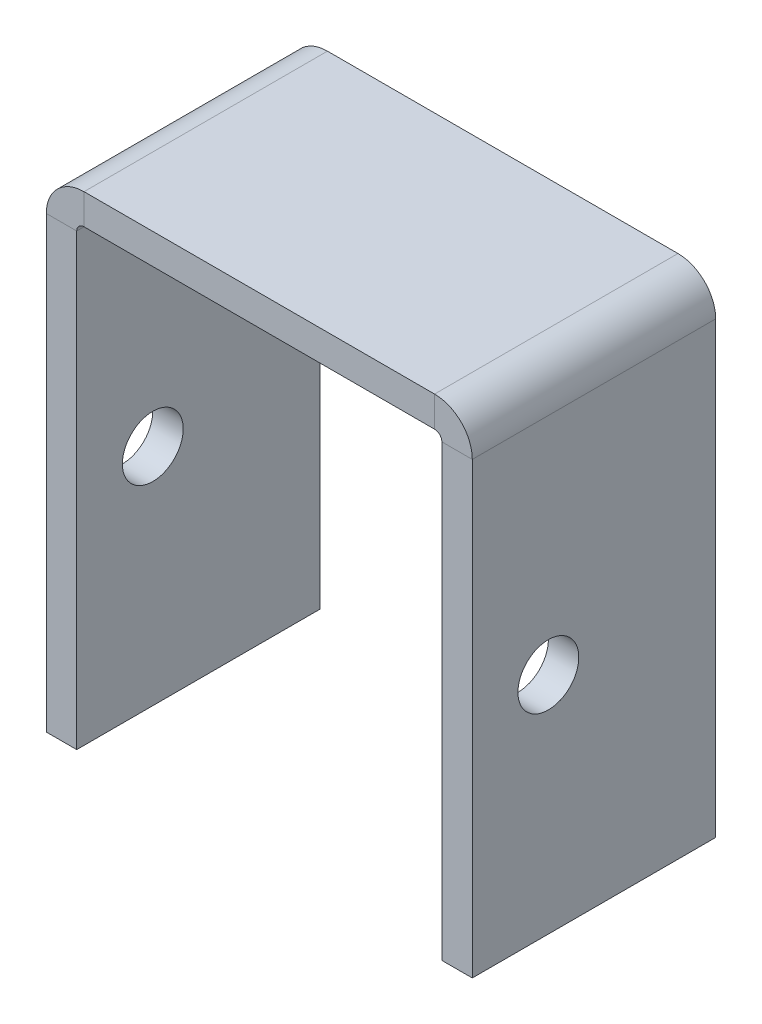
ISO-10303-21;
HEADER;
FILE_DESCRIPTION(('STEP AP214'),'2;1');
FILE_NAME('part.step','',(''),(''),'','','');
FILE_SCHEMA(('AUTOMOTIVE_DESIGN { 1 0 10303 214 1 1 1 1 }'));
ENDSEC;
DATA;
#1=APPLICATION_CONTEXT('core data for automotive mechanical design processes');
#2=APPLICATION_PROTOCOL_DEFINITION('international standard','automotive_design',2000,#1);
#3=PRODUCT_CONTEXT('',#1,'mechanical');
#4=PRODUCT('Part','Part','',(#3));
#5=PRODUCT_RELATED_PRODUCT_CATEGORY('part','',(#4));
#6=PRODUCT_DEFINITION_FORMATION('','',#4);
#7=PRODUCT_DEFINITION_CONTEXT('part definition',#1,'design');
#8=PRODUCT_DEFINITION('design','',#6,#7);
#9=PRODUCT_DEFINITION_SHAPE('','',#8);
#10=(LENGTH_UNIT() NAMED_UNIT(*) SI_UNIT(.MILLI.,.METRE.));
#11=(NAMED_UNIT(*) PLANE_ANGLE_UNIT() SI_UNIT($,.RADIAN.));
#12=(NAMED_UNIT(*) SI_UNIT($,.STERADIAN.) SOLID_ANGLE_UNIT());
#13=UNCERTAINTY_MEASURE_WITH_UNIT(LENGTH_MEASURE(1.E-05),#10,'distance_accuracy_value','');
#14=(GEOMETRIC_REPRESENTATION_CONTEXT(3) GLOBAL_UNCERTAINTY_ASSIGNED_CONTEXT((#13)) GLOBAL_UNIT_ASSIGNED_CONTEXT((#10,
#11,#12)) REPRESENTATION_CONTEXT('',''));
#15=CARTESIAN_POINT('',(0.,0.,0.));
#16=DIRECTION('',(0.,0.,1.));
#17=DIRECTION('',(1.,0.,0.));
#18=AXIS2_PLACEMENT_3D('',#15,#16,#17);
#19=CARTESIAN_POINT('',(22.225,-3.93699999999999,25.4));
#20=DIRECTION('',(0.,0.,1.));
#21=DIRECTION('',(1.,0.,0.));
#22=AXIS2_PLACEMENT_3D('',#19,#20,#21);
#23=PLANE('',#22);
#24=DIRECTION('',(-1.,0.,0.));
#25=VECTOR('',#24,1.);
#26=CARTESIAN_POINT('',(22.225,-3.93699999999999,25.4));
#27=LINE('',#26,#25);
#28=CARTESIAN_POINT('',(22.225,-3.93699999999999,25.4));
#29=VERTEX_POINT('',#28);
#30=CARTESIAN_POINT('',(19.05,-3.93699999999999,25.4));
#31=VERTEX_POINT('',#30);
#32=EDGE_CURVE('E11',#29,#31,#27,.T.);
#33=ORIENTED_EDGE('',*,*,#32,.F.);
#34=CARTESIAN_POINT('',(18.288,-3.93699999999999,25.4));
#35=DIRECTION('',(0.,0.,-1.));
#36=DIRECTION('',(-1.,0.,0.));
#37=AXIS2_PLACEMENT_3D('',#34,#35,#36);
#38=CIRCLE('',#37,3.937);
#39=CARTESIAN_POINT('',(18.288,0.,25.4));
#40=VERTEX_POINT('',#39);
#41=EDGE_CURVE('E253',#40,#29,#38,.T.);
#42=ORIENTED_EDGE('',*,*,#41,.F.);
#43=DIRECTION('',(0.,1.,0.));
#44=VECTOR('',#43,1.);
#45=CARTESIAN_POINT('',(18.288,-3.17499999999999,25.4));
#46=LINE('',#45,#44);
#47=CARTESIAN_POINT('',(18.288,-3.17499999999999,25.4));
#48=VERTEX_POINT('',#47);
#49=EDGE_CURVE('E54',#48,#40,#46,.T.);
#50=ORIENTED_EDGE('',*,*,#49,.F.);
#51=CARTESIAN_POINT('',(18.288,-3.93699999999999,25.4));
#52=DIRECTION('',(0.,0.,1.));
#53=DIRECTION('',(1.,0.,0.));
#54=AXIS2_PLACEMENT_3D('',#51,#52,#53);
#55=CIRCLE('',#54,0.762);
#56=EDGE_CURVE('E178',#48,#31,#55,.F.);
#57=ORIENTED_EDGE('',*,*,#56,.T.);
#58=EDGE_LOOP('',(#33,#42,#50,#57));
#59=FACE_BOUND('',#58,.T.);
#60=ADVANCED_FACE('F45',(#59),#23,.T.);
#61=CARTESIAN_POINT('',(18.288,-3.17499999999999,25.4));
#62=DIRECTION('',(0.,0.,1.));
#63=DIRECTION('',(1.,0.,0.));
#64=AXIS2_PLACEMENT_3D('',#61,#62,#63);
#65=PLANE('',#64);
#66=DIRECTION('',(0.,-1.,0.));
#67=VECTOR('',#66,1.);
#68=CARTESIAN_POINT('',(22.225,0.,25.4));
#69=LINE('',#68,#67);
#70=CARTESIAN_POINT('',(22.225,-50.8,25.4));
#71=VERTEX_POINT('',#70);
#72=EDGE_CURVE('E257',#29,#71,#69,.T.);
#73=ORIENTED_EDGE('',*,*,#72,.F.);
#74=ORIENTED_EDGE('',*,*,#32,.T.);
#75=DIRECTION('',(0.,-1.,0.));
#76=VECTOR('',#75,1.);
#77=CARTESIAN_POINT('',(19.05,0.,25.4));
#78=LINE('',#77,#76);
#79=CARTESIAN_POINT('',(19.05,-50.8,25.4));
#80=VERTEX_POINT('',#79);
#81=EDGE_CURVE('E114',#31,#80,#78,.T.);
#82=ORIENTED_EDGE('',*,*,#81,.T.);
#83=DIRECTION('',(-1.,0.,0.));
#84=VECTOR('',#83,1.);
#85=CARTESIAN_POINT('',(22.225,-50.8,25.4));
#86=LINE('',#85,#84);
#87=EDGE_CURVE('E561',#71,#80,#86,.T.);
#88=ORIENTED_EDGE('',*,*,#87,.F.);
#89=EDGE_LOOP('',(#73,#74,#82,#88));
#90=FACE_BOUND('',#89,.T.);
#91=ADVANCED_FACE('F307',(#90),#65,.T.);
#92=CARTESIAN_POINT('',(18.288,0.,0.));
#93=DIRECTION('',(0.,0.,-1.));
#94=DIRECTION('',(-1.,0.,0.));
#95=AXIS2_PLACEMENT_3D('',#92,#93,#94);
#96=PLANE('',#95);
#97=DIRECTION('',(0.,-1.,0.));
#98=VECTOR('',#97,1.);
#99=CARTESIAN_POINT('',(18.288,0.,0.));
#100=LINE('',#99,#98);
#101=CARTESIAN_POINT('',(18.288,0.,0.));
#102=VERTEX_POINT('',#101);
#103=CARTESIAN_POINT('',(18.288,-3.17499999999999,0.));
#104=VERTEX_POINT('',#103);
#105=EDGE_CURVE('E101',#102,#104,#100,.T.);
#106=ORIENTED_EDGE('',*,*,#105,.F.);
#107=CARTESIAN_POINT('',(18.288,-3.93699999999999,0.));
#108=DIRECTION('',(0.,0.,-1.));
#109=DIRECTION('',(-1.,0.,0.));
#110=AXIS2_PLACEMENT_3D('',#107,#108,#109);
#111=CIRCLE('',#110,3.937);
#112=CARTESIAN_POINT('',(22.225,-3.93699999999999,0.));
#113=VERTEX_POINT('',#112);
#114=EDGE_CURVE('E194',#102,#113,#111,.T.);
#115=ORIENTED_EDGE('',*,*,#114,.T.);
#116=DIRECTION('',(1.,0.,0.));
#117=VECTOR('',#116,1.);
#118=CARTESIAN_POINT('',(19.05,-3.93699999999999,0.));
#119=LINE('',#118,#117);
#120=CARTESIAN_POINT('',(19.05,-3.93699999999999,0.));
#121=VERTEX_POINT('',#120);
#122=EDGE_CURVE('E108',#121,#113,#119,.T.);
#123=ORIENTED_EDGE('',*,*,#122,.F.);
#124=CARTESIAN_POINT('',(18.288,-3.93699999999999,0.));
#125=DIRECTION('',(0.,0.,1.));
#126=DIRECTION('',(1.,0.,0.));
#127=AXIS2_PLACEMENT_3D('',#124,#125,#126);
#128=CIRCLE('',#127,0.762);
#129=EDGE_CURVE('E213',#104,#121,#128,.F.);
#130=ORIENTED_EDGE('',*,*,#129,.F.);
#131=EDGE_LOOP('',(#106,#115,#123,#130));
#132=FACE_BOUND('',#131,.T.);
#133=ADVANCED_FACE('F311',(#132),#96,.T.);
#134=CARTESIAN_POINT('',(19.05,-3.93699999999999,0.));
#135=DIRECTION('',(0.,0.,-1.));
#136=DIRECTION('',(-1.,0.,0.));
#137=AXIS2_PLACEMENT_3D('',#134,#135,#136);
#138=PLANE('',#137);
#139=DIRECTION('',(1.,0.,0.));
#140=VECTOR('',#139,1.);
#141=CARTESIAN_POINT('',(-22.225,0.,0.));
#142=LINE('',#141,#140);
#143=CARTESIAN_POINT('',(-18.288,0.,0.));
#144=VERTEX_POINT('',#143);
#145=EDGE_CURVE('E196',#144,#102,#142,.T.);
#146=ORIENTED_EDGE('',*,*,#145,.T.);
#147=ORIENTED_EDGE('',*,*,#105,.T.);
#148=DIRECTION('',(1.,0.,0.));
#149=VECTOR('',#148,1.);
#150=CARTESIAN_POINT('',(-22.225,-3.175,0.));
#151=LINE('',#150,#149);
#152=CARTESIAN_POINT('',(-18.288,-3.175,0.));
#153=VERTEX_POINT('',#152);
#154=EDGE_CURVE('E211',#153,#104,#151,.T.);
#155=ORIENTED_EDGE('',*,*,#154,.F.);
#156=DIRECTION('',(0.,1.,0.));
#157=VECTOR('',#156,1.);
#158=CARTESIAN_POINT('',(-18.288,-3.175,0.));
#159=LINE('',#158,#157);
#160=EDGE_CURVE('E239',#153,#144,#159,.T.);
#161=ORIENTED_EDGE('',*,*,#160,.T.);
#162=EDGE_LOOP('',(#146,#147,#155,#161));
#163=FACE_BOUND('',#162,.T.);
#164=ADVANCED_FACE('F283',(#163),#138,.T.);
#165=CARTESIAN_POINT('',(-18.288,0.,25.4));
#166=DIRECTION('',(0.,0.,1.));
#167=DIRECTION('',(1.,0.,0.));
#168=AXIS2_PLACEMENT_3D('',#165,#166,#167);
#169=PLANE('',#168);
#170=DIRECTION('',(0.,-1.,0.));
#171=VECTOR('',#170,1.);
#172=CARTESIAN_POINT('',(-18.288,0.,25.4));
#173=LINE('',#172,#171);
#174=CARTESIAN_POINT('',(-18.288,0.,25.4));
#175=VERTEX_POINT('',#174);
#176=CARTESIAN_POINT('',(-18.288,-3.175,25.4));
#177=VERTEX_POINT('',#176);
#178=EDGE_CURVE('E142',#175,#177,#173,.T.);
#179=ORIENTED_EDGE('',*,*,#178,.F.);
#180=CARTESIAN_POINT('',(-18.288,-3.937,25.4));
#181=DIRECTION('',(0.,0.,-1.));
#182=DIRECTION('',(-1.,0.,0.));
#183=AXIS2_PLACEMENT_3D('',#180,#181,#182);
#184=CIRCLE('',#183,3.937);
#185=CARTESIAN_POINT('',(-22.225,-3.937,25.4));
#186=VERTEX_POINT('',#185);
#187=EDGE_CURVE('E260',#186,#175,#184,.T.);
#188=ORIENTED_EDGE('',*,*,#187,.F.);
#189=DIRECTION('',(-1.,0.,0.));
#190=VECTOR('',#189,1.);
#191=CARTESIAN_POINT('',(-19.05,-3.937,25.4));
#192=LINE('',#191,#190);
#193=CARTESIAN_POINT('',(-19.05,-3.937,25.4));
#194=VERTEX_POINT('',#193);
#195=EDGE_CURVE('E154',#194,#186,#192,.T.);
#196=ORIENTED_EDGE('',*,*,#195,.F.);
#197=CARTESIAN_POINT('',(-18.288,-3.937,25.4));
#198=DIRECTION('',(0.,0.,1.));
#199=DIRECTION('',(1.,0.,0.));
#200=AXIS2_PLACEMENT_3D('',#197,#198,#199);
#201=CIRCLE('',#200,0.762);
#202=EDGE_CURVE('E157',#194,#177,#201,.F.);
#203=ORIENTED_EDGE('',*,*,#202,.T.);
#204=EDGE_LOOP('',(#179,#188,#196,#203));
#205=FACE_BOUND('',#204,.T.);
#206=ADVANCED_FACE('F159',(#205),#169,.T.);
#207=CARTESIAN_POINT('',(-19.05,-3.937,25.4));
#208=DIRECTION('',(0.,0.,1.));
#209=DIRECTION('',(1.,0.,0.));
#210=AXIS2_PLACEMENT_3D('',#207,#208,#209);
#211=PLANE('',#210);
#212=DIRECTION('',(1.,0.,0.));
#213=VECTOR('',#212,1.);
#214=CARTESIAN_POINT('',(-22.225,0.,25.4));
#215=LINE('',#214,#213);
#216=EDGE_CURVE('E149',#175,#40,#215,.T.);
#217=ORIENTED_EDGE('',*,*,#216,.F.);
#218=ORIENTED_EDGE('',*,*,#178,.T.);
#219=DIRECTION('',(1.,0.,0.));
#220=VECTOR('',#219,1.);
#221=CARTESIAN_POINT('',(-22.225,-3.175,25.4));
#222=LINE('',#221,#220);
#223=EDGE_CURVE('E146',#177,#48,#222,.T.);
#224=ORIENTED_EDGE('',*,*,#223,.T.);
#225=ORIENTED_EDGE('',*,*,#49,.T.);
#226=EDGE_LOOP('',(#217,#218,#224,#225));
#227=FACE_BOUND('',#226,.T.);
#228=ADVANCED_FACE('F144',(#227),#211,.T.);
#229=CARTESIAN_POINT('',(-22.225,-3.937,0.));
#230=DIRECTION('',(0.,0.,-1.));
#231=DIRECTION('',(-1.,0.,0.));
#232=AXIS2_PLACEMENT_3D('',#229,#230,#231);
#233=PLANE('',#232);
#234=DIRECTION('',(1.,0.,0.));
#235=VECTOR('',#234,1.);
#236=CARTESIAN_POINT('',(-22.225,-3.937,0.));
#237=LINE('',#236,#235);
#238=CARTESIAN_POINT('',(-22.225,-3.937,0.));
#239=VERTEX_POINT('',#238);
#240=CARTESIAN_POINT('',(-19.05,-3.937,0.));
#241=VERTEX_POINT('',#240);
#242=EDGE_CURVE('E241',#239,#241,#237,.T.);
#243=ORIENTED_EDGE('',*,*,#242,.F.);
#244=CARTESIAN_POINT('',(-18.288,-3.937,0.));
#245=DIRECTION('',(0.,0.,-1.));
#246=DIRECTION('',(-1.,0.,0.));
#247=AXIS2_PLACEMENT_3D('',#244,#245,#246);
#248=CIRCLE('',#247,3.937);
#249=EDGE_CURVE('E198',#239,#144,#248,.T.);
#250=ORIENTED_EDGE('',*,*,#249,.T.);
#251=ORIENTED_EDGE('',*,*,#160,.F.);
#252=CARTESIAN_POINT('',(-18.288,-3.937,0.));
#253=DIRECTION('',(0.,0.,1.));
#254=DIRECTION('',(1.,0.,0.));
#255=AXIS2_PLACEMENT_3D('',#252,#253,#254);
#256=CIRCLE('',#255,0.762);
#257=EDGE_CURVE('E170',#241,#153,#256,.F.);
#258=ORIENTED_EDGE('',*,*,#257,.F.);
#259=EDGE_LOOP('',(#243,#250,#251,#258));
#260=FACE_BOUND('',#259,.T.);
#261=ADVANCED_FACE('F281',(#260),#233,.T.);
#262=CARTESIAN_POINT('',(-18.288,-3.175,0.));
#263=DIRECTION('',(0.,0.,-1.));
#264=DIRECTION('',(-1.,0.,0.));
#265=AXIS2_PLACEMENT_3D('',#262,#263,#264);
#266=PLANE('',#265);
#267=DIRECTION('',(0.,1.,0.));
#268=VECTOR('',#267,1.);
#269=CARTESIAN_POINT('',(-22.225,0.,0.));
#270=LINE('',#269,#268);
#271=CARTESIAN_POINT('',(-22.225,-50.8,0.));
#272=VERTEX_POINT('',#271);
#273=EDGE_CURVE('E201',#272,#239,#270,.T.);
#274=ORIENTED_EDGE('',*,*,#273,.T.);
#275=ORIENTED_EDGE('',*,*,#242,.T.);
#276=DIRECTION('',(0.,1.,0.));
#277=VECTOR('',#276,1.);
#278=CARTESIAN_POINT('',(-19.05,0.,0.));
#279=LINE('',#278,#277);
#280=CARTESIAN_POINT('',(-19.05,-50.8,0.));
#281=VERTEX_POINT('',#280);
#282=EDGE_CURVE('E207',#281,#241,#279,.T.);
#283=ORIENTED_EDGE('',*,*,#282,.F.);
#284=DIRECTION('',(-1.,0.,0.));
#285=VECTOR('',#284,1.);
#286=CARTESIAN_POINT('',(-19.05,-50.8,0.));
#287=LINE('',#286,#285);
#288=EDGE_CURVE('E204',#281,#272,#287,.T.);
#289=ORIENTED_EDGE('',*,*,#288,.T.);
#290=EDGE_LOOP('',(#274,#275,#283,#289));
#291=FACE_BOUND('',#290,.T.);
#292=ADVANCED_FACE('F293',(#291),#266,.T.);
#293=CARTESIAN_POINT('',(19.05,0.,25.4));
#294=DIRECTION('',(1.,0.,0.));
#295=DIRECTION('',(0.,1.,0.));
#296=AXIS2_PLACEMENT_3D('',#293,#294,#295);
#297=PLANE('',#296);
#298=CARTESIAN_POINT('',(19.05,-27.3685,17.4625));
#299=DIRECTION('',(1.,0.,0.));
#300=DIRECTION('',(0.,1.,0.));
#301=AXIS2_PLACEMENT_3D('',#298,#299,#300);
#302=CIRCLE('',#301,3.175);
#303=CARTESIAN_POINT('',(19.05,-27.3685,20.6375));
#304=VERTEX_POINT('',#303);
#305=EDGE_CURVE('E188',#304,#304,#302,.F.);
#306=ORIENTED_EDGE('',*,*,#305,.F.);
#307=EDGE_LOOP('',(#306));
#308=FACE_BOUND('',#307,.T.);
#309=DIRECTION('',(0.,-1.,0.));
#310=VECTOR('',#309,1.);
#311=CARTESIAN_POINT('',(19.05,0.,0.));
#312=LINE('',#311,#310);
#313=CARTESIAN_POINT('',(19.05,-50.8,0.));
#314=VERTEX_POINT('',#313);
#315=EDGE_CURVE('E184',#121,#314,#312,.T.);
#316=ORIENTED_EDGE('',*,*,#315,.T.);
#317=DIRECTION('',(0.,0.,-1.));
#318=VECTOR('',#317,1.);
#319=CARTESIAN_POINT('',(19.05,-50.8,25.4));
#320=LINE('',#319,#318);
#321=EDGE_CURVE('E237',#80,#314,#320,.T.);
#322=ORIENTED_EDGE('',*,*,#321,.F.);
#323=ORIENTED_EDGE('',*,*,#81,.F.);
#324=DIRECTION('',(0.,0.,-1.));
#325=VECTOR('',#324,1.);
#326=CARTESIAN_POINT('',(19.05,-3.93699999999999,25.4));
#327=LINE('',#326,#325);
#328=EDGE_CURVE('E180',#31,#121,#327,.T.);
#329=ORIENTED_EDGE('',*,*,#328,.T.);
#330=EDGE_LOOP('',(#316,#322,#323,#329));
#331=FACE_BOUND('',#330,.T.);
#332=ADVANCED_FACE('F295',(#308,#331),#297,.F.);
#333=CARTESIAN_POINT('',(22.225,-50.8,25.4));
#334=DIRECTION('',(0.,-1.,0.));
#335=DIRECTION('',(0.,0.,-1.));
#336=AXIS2_PLACEMENT_3D('',#333,#334,#335);
#337=PLANE('',#336);
#338=DIRECTION('',(-1.,0.,0.));
#339=VECTOR('',#338,1.);
#340=CARTESIAN_POINT('',(22.225,-50.8,0.));
#341=LINE('',#340,#339);
#342=CARTESIAN_POINT('',(22.225,-50.8,0.));
#343=VERTEX_POINT('',#342);
#344=EDGE_CURVE('E187',#343,#314,#341,.T.);
#345=ORIENTED_EDGE('',*,*,#344,.F.);
#346=DIRECTION('',(0.,0.,-1.));
#347=VECTOR('',#346,1.);
#348=CARTESIAN_POINT('',(22.225,-50.8,25.4));
#349=LINE('',#348,#347);
#350=EDGE_CURVE('E235',#71,#343,#349,.T.);
#351=ORIENTED_EDGE('',*,*,#350,.F.);
#352=ORIENTED_EDGE('',*,*,#87,.T.);
#353=ORIENTED_EDGE('',*,*,#321,.T.);
#354=EDGE_LOOP('',(#345,#351,#352,#353));
#355=FACE_BOUND('',#354,.T.);
#356=ADVANCED_FACE('F302',(#355),#337,.T.);
#357=CARTESIAN_POINT('',(22.225,0.,25.4));
#358=DIRECTION('',(1.,0.,0.));
#359=DIRECTION('',(0.,1.,0.));
#360=AXIS2_PLACEMENT_3D('',#357,#358,#359);
#361=PLANE('',#360);
#362=CARTESIAN_POINT('',(22.225,-27.3685,17.4625));
#363=DIRECTION('',(1.,0.,0.));
#364=DIRECTION('',(0.,0.,-1.));
#365=AXIS2_PLACEMENT_3D('',#362,#363,#364);
#366=CIRCLE('',#365,3.175);
#367=CARTESIAN_POINT('',(22.225,-27.3685,20.6375));
#368=VERTEX_POINT('',#367);
#369=EDGE_CURVE('E552',#368,#368,#366,.T.);
#370=ORIENTED_EDGE('',*,*,#369,.F.);
#371=EDGE_LOOP('',(#370));
#372=FACE_BOUND('',#371,.T.);
#373=DIRECTION('',(0.,-1.,0.));
#374=VECTOR('',#373,1.);
#375=CARTESIAN_POINT('',(22.225,0.,0.));
#376=LINE('',#375,#374);
#377=EDGE_CURVE('E191',#113,#343,#376,.T.);
#378=ORIENTED_EDGE('',*,*,#377,.F.);
#379=DIRECTION('',(0.,0.,-1.));
#380=VECTOR('',#379,1.);
#381=CARTESIAN_POINT('',(22.225,-3.93699999999999,25.4));
#382=LINE('',#381,#380);
#383=EDGE_CURVE('E232',#29,#113,#382,.T.);
#384=ORIENTED_EDGE('',*,*,#383,.F.);
#385=ORIENTED_EDGE('',*,*,#72,.T.);
#386=ORIENTED_EDGE('',*,*,#350,.T.);
#387=EDGE_LOOP('',(#378,#384,#385,#386));
#388=FACE_BOUND('',#387,.T.);
#389=ADVANCED_FACE('F355',(#372,#388),#361,.T.);
#390=CARTESIAN_POINT('',(18.288,-3.93699999999999,25.4));
#391=DIRECTION('',(0.,0.,-1.));
#392=DIRECTION('',(-1.,0.,0.));
#393=AXIS2_PLACEMENT_3D('',#390,#391,#392);
#394=CYLINDRICAL_SURFACE('',#393,3.937);
#395=ORIENTED_EDGE('',*,*,#114,.F.);
#396=DIRECTION('',(0.,0.,-1.));
#397=VECTOR('',#396,1.);
#398=CARTESIAN_POINT('',(18.288,0.,25.4));
#399=LINE('',#398,#397);
#400=EDGE_CURVE('E229',#40,#102,#399,.T.);
#401=ORIENTED_EDGE('',*,*,#400,.F.);
#402=ORIENTED_EDGE('',*,*,#41,.T.);
#403=ORIENTED_EDGE('',*,*,#383,.T.);
#404=EDGE_LOOP('',(#395,#401,#402,#403));
#405=FACE_BOUND('',#404,.T.);
#406=ADVANCED_FACE('F252',(#405),#394,.T.);
#407=CARTESIAN_POINT('',(-22.225,0.,25.4));
#408=DIRECTION('',(0.,1.,0.));
#409=DIRECTION('',(-1.,0.,0.));
#410=AXIS2_PLACEMENT_3D('',#407,#408,#409);
#411=PLANE('',#410);
#412=ORIENTED_EDGE('',*,*,#145,.F.);
#413=DIRECTION('',(0.,0.,-1.));
#414=VECTOR('',#413,1.);
#415=CARTESIAN_POINT('',(-18.288,0.,25.4));
#416=LINE('',#415,#414);
#417=EDGE_CURVE('E226',#175,#144,#416,.T.);
#418=ORIENTED_EDGE('',*,*,#417,.F.);
#419=ORIENTED_EDGE('',*,*,#216,.T.);
#420=ORIENTED_EDGE('',*,*,#400,.T.);
#421=EDGE_LOOP('',(#412,#418,#419,#420));
#422=FACE_BOUND('',#421,.T.);
#423=ADVANCED_FACE('F259',(#422),#411,.T.);
#424=CARTESIAN_POINT('',(-18.288,-3.937,25.4));
#425=DIRECTION('',(0.,0.,-1.));
#426=DIRECTION('',(-1.,0.,0.));
#427=AXIS2_PLACEMENT_3D('',#424,#425,#426);
#428=CYLINDRICAL_SURFACE('',#427,3.937);
#429=ORIENTED_EDGE('',*,*,#249,.F.);
#430=DIRECTION('',(0.,0.,-1.));
#431=VECTOR('',#430,1.);
#432=CARTESIAN_POINT('',(-22.225,-3.937,25.4));
#433=LINE('',#432,#431);
#434=EDGE_CURVE('E223',#186,#239,#433,.T.);
#435=ORIENTED_EDGE('',*,*,#434,.F.);
#436=ORIENTED_EDGE('',*,*,#187,.T.);
#437=ORIENTED_EDGE('',*,*,#417,.T.);
#438=EDGE_LOOP('',(#429,#435,#436,#437));
#439=FACE_BOUND('',#438,.T.);
#440=ADVANCED_FACE('F285',(#439),#428,.T.);
#441=CARTESIAN_POINT('',(-22.225,0.,25.4));
#442=DIRECTION('',(-1.,0.,0.));
#443=DIRECTION('',(0.,-1.,0.));
#444=AXIS2_PLACEMENT_3D('',#441,#442,#443);
#445=PLANE('',#444);
#446=CARTESIAN_POINT('',(-22.225,-27.3685,17.4625));
#447=DIRECTION('',(1.,0.,0.));
#448=DIRECTION('',(0.,0.,-1.));
#449=AXIS2_PLACEMENT_3D('',#446,#447,#448);
#450=CIRCLE('',#449,3.175);
#451=CARTESIAN_POINT('',(-22.225,-27.3685,20.6375));
#452=VERTEX_POINT('',#451);
#453=EDGE_CURVE('E570',#452,#452,#450,.T.);
#454=ORIENTED_EDGE('',*,*,#453,.T.);
#455=EDGE_LOOP('',(#454));
#456=FACE_BOUND('',#455,.T.);
#457=ORIENTED_EDGE('',*,*,#273,.F.);
#458=DIRECTION('',(0.,0.,-1.));
#459=VECTOR('',#458,1.);
#460=CARTESIAN_POINT('',(-22.225,-50.8,25.4));
#461=LINE('',#460,#459);
#462=CARTESIAN_POINT('',(-22.225,-50.8,25.4));
#463=VERTEX_POINT('',#462);
#464=EDGE_CURVE('E221',#463,#272,#461,.T.);
#465=ORIENTED_EDGE('',*,*,#464,.F.);
#466=DIRECTION('',(0.,1.,0.));
#467=VECTOR('',#466,1.);
#468=CARTESIAN_POINT('',(-22.225,0.,25.4));
#469=LINE('',#468,#467);
#470=EDGE_CURVE('E262',#463,#186,#469,.T.);
#471=ORIENTED_EDGE('',*,*,#470,.T.);
#472=ORIENTED_EDGE('',*,*,#434,.T.);
#473=EDGE_LOOP('',(#457,#465,#471,#472));
#474=FACE_BOUND('',#473,.T.);
#475=ADVANCED_FACE('F288',(#456,#474),#445,.T.);
#476=CARTESIAN_POINT('',(-19.05,-50.8,25.4));
#477=DIRECTION('',(0.,-1.,0.));
#478=DIRECTION('',(0.,0.,-1.));
#479=AXIS2_PLACEMENT_3D('',#476,#477,#478);
#480=PLANE('',#479);
#481=ORIENTED_EDGE('',*,*,#288,.F.);
#482=DIRECTION('',(0.,0.,-1.));
#483=VECTOR('',#482,1.);
#484=CARTESIAN_POINT('',(-19.05,-50.8,25.4));
#485=LINE('',#484,#483);
#486=CARTESIAN_POINT('',(-19.05,-50.8,25.4));
#487=VERTEX_POINT('',#486);
#488=EDGE_CURVE('E219',#487,#281,#485,.T.);
#489=ORIENTED_EDGE('',*,*,#488,.F.);
#490=DIRECTION('',(-1.,0.,0.));
#491=VECTOR('',#490,1.);
#492=CARTESIAN_POINT('',(-19.05,-50.8,25.4));
#493=LINE('',#492,#491);
#494=EDGE_CURVE('E268',#487,#463,#493,.T.);
#495=ORIENTED_EDGE('',*,*,#494,.T.);
#496=ORIENTED_EDGE('',*,*,#464,.T.);
#497=EDGE_LOOP('',(#481,#489,#495,#496));
#498=FACE_BOUND('',#497,.T.);
#499=ADVANCED_FACE('F291',(#498),#480,.T.);
#500=CARTESIAN_POINT('',(-19.05,0.,25.4));
#501=DIRECTION('',(-1.,0.,0.));
#502=DIRECTION('',(0.,-1.,0.));
#503=AXIS2_PLACEMENT_3D('',#500,#501,#502);
#504=PLANE('',#503);
#505=CARTESIAN_POINT('',(-19.05,-27.3685,17.4625));
#506=DIRECTION('',(-1.,0.,0.));
#507=DIRECTION('',(0.,-1.,0.));
#508=AXIS2_PLACEMENT_3D('',#505,#506,#507);
#509=CIRCLE('',#508,3.175);
#510=CARTESIAN_POINT('',(-19.05,-27.3685,20.6375));
#511=VERTEX_POINT('',#510);
#512=EDGE_CURVE('E48',#511,#511,#509,.F.);
#513=ORIENTED_EDGE('',*,*,#512,.F.);
#514=EDGE_LOOP('',(#513));
#515=FACE_BOUND('',#514,.T.);
#516=ORIENTED_EDGE('',*,*,#282,.T.);
#517=DIRECTION('',(0.,0.,-1.));
#518=VECTOR('',#517,1.);
#519=CARTESIAN_POINT('',(-19.05,-3.937,25.4));
#520=LINE('',#519,#518);
#521=EDGE_CURVE('E172',#194,#241,#520,.T.);
#522=ORIENTED_EDGE('',*,*,#521,.F.);
#523=DIRECTION('',(0.,1.,0.));
#524=VECTOR('',#523,1.);
#525=CARTESIAN_POINT('',(-19.05,0.,25.4));
#526=LINE('',#525,#524);
#527=EDGE_CURVE('E163',#487,#194,#526,.T.);
#528=ORIENTED_EDGE('',*,*,#527,.F.);
#529=ORIENTED_EDGE('',*,*,#488,.T.);
#530=EDGE_LOOP('',(#516,#522,#528,#529));
#531=FACE_BOUND('',#530,.T.);
#532=ADVANCED_FACE('F278',(#515,#531),#504,.F.);
#533=CARTESIAN_POINT('',(-18.288,-3.937,25.4));
#534=DIRECTION('',(0.,0.,-1.));
#535=DIRECTION('',(-1.,0.,0.));
#536=AXIS2_PLACEMENT_3D('',#533,#534,#535);
#537=CYLINDRICAL_SURFACE('',#536,0.762);
#538=ORIENTED_EDGE('',*,*,#257,.T.);
#539=DIRECTION('',(0.,0.,-1.));
#540=VECTOR('',#539,1.);
#541=CARTESIAN_POINT('',(-18.288,-3.175,25.4));
#542=LINE('',#541,#540);
#543=EDGE_CURVE('E167',#177,#153,#542,.T.);
#544=ORIENTED_EDGE('',*,*,#543,.F.);
#545=ORIENTED_EDGE('',*,*,#202,.F.);
#546=ORIENTED_EDGE('',*,*,#521,.T.);
#547=EDGE_LOOP('',(#538,#544,#545,#546));
#548=FACE_BOUND('',#547,.T.);
#549=ADVANCED_FACE('F168',(#548),#537,.F.);
#550=CARTESIAN_POINT('',(-22.225,-3.175,25.4));
#551=DIRECTION('',(0.,1.,0.));
#552=DIRECTION('',(-1.,0.,0.));
#553=AXIS2_PLACEMENT_3D('',#550,#551,#552);
#554=PLANE('',#553);
#555=ORIENTED_EDGE('',*,*,#154,.T.);
#556=DIRECTION('',(0.,0.,-1.));
#557=VECTOR('',#556,1.);
#558=CARTESIAN_POINT('',(18.288,-3.17499999999999,25.4));
#559=LINE('',#558,#557);
#560=EDGE_CURVE('E173',#48,#104,#559,.T.);
#561=ORIENTED_EDGE('',*,*,#560,.F.);
#562=ORIENTED_EDGE('',*,*,#223,.F.);
#563=ORIENTED_EDGE('',*,*,#543,.T.);
#564=EDGE_LOOP('',(#555,#561,#562,#563));
#565=FACE_BOUND('',#564,.T.);
#566=ADVANCED_FACE('F175',(#565),#554,.F.);
#567=CARTESIAN_POINT('',(18.288,-3.93699999999999,25.4));
#568=DIRECTION('',(0.,0.,-1.));
#569=DIRECTION('',(-1.,0.,0.));
#570=AXIS2_PLACEMENT_3D('',#567,#568,#569);
#571=CYLINDRICAL_SURFACE('',#570,0.762);
#572=ORIENTED_EDGE('',*,*,#129,.T.);
#573=ORIENTED_EDGE('',*,*,#328,.F.);
#574=ORIENTED_EDGE('',*,*,#56,.F.);
#575=ORIENTED_EDGE('',*,*,#560,.T.);
#576=EDGE_LOOP('',(#572,#573,#574,#575));
#577=FACE_BOUND('',#576,.T.);
#578=ADVANCED_FACE('F441',(#577),#571,.F.);
#579=CARTESIAN_POINT('',(18.288,-3.93699999999999,25.4));
#580=DIRECTION('',(0.,0.,-1.));
#581=DIRECTION('',(-1.,0.,0.));
#582=AXIS2_PLACEMENT_3D('',#579,#580,#581);
#583=PLANE('',#582);
#584=ORIENTED_EDGE('',*,*,#527,.T.);
#585=ORIENTED_EDGE('',*,*,#195,.T.);
#586=ORIENTED_EDGE('',*,*,#470,.F.);
#587=ORIENTED_EDGE('',*,*,#494,.F.);
#588=EDGE_LOOP('',(#584,#585,#586,#587));
#589=FACE_BOUND('',#588,.T.);
#590=ADVANCED_FACE('F274',(#589),#583,.F.);
#591=CARTESIAN_POINT('',(18.288,-3.93699999999999,0.));
#592=DIRECTION('',(0.,0.,-1.));
#593=DIRECTION('',(-1.,0.,0.));
#594=AXIS2_PLACEMENT_3D('',#591,#592,#593);
#595=PLANE('',#594);
#596=ORIENTED_EDGE('',*,*,#315,.F.);
#597=ORIENTED_EDGE('',*,*,#122,.T.);
#598=ORIENTED_EDGE('',*,*,#377,.T.);
#599=ORIENTED_EDGE('',*,*,#344,.T.);
#600=EDGE_LOOP('',(#596,#597,#598,#599));
#601=FACE_BOUND('',#600,.T.);
#602=ADVANCED_FACE('F461',(#601),#595,.T.);
#603=CARTESIAN_POINT('',(22.225,-27.3685,17.4625));
#604=DIRECTION('',(-1.,0.,0.));
#605=DIRECTION('',(0.,0.,1.));
#606=AXIS2_PLACEMENT_3D('',#603,#604,#605);
#607=CYLINDRICAL_SURFACE('',#606,3.175);
#608=CARTESIAN_POINT('',(-22.225,-27.3685,20.6375));
#609=CARTESIAN_POINT('',(-22.1919270833333,-27.3685,20.6375));
#610=CARTESIAN_POINT('',(-22.1588541666667,-27.3685,20.6375));
#611=CARTESIAN_POINT('',(-22.0927083333333,-27.3685,20.6375));
#612=CARTESIAN_POINT('',(-22.0596354166667,-27.3685,20.6375));
#613=CARTESIAN_POINT('',(-21.9934895833333,-27.3685,20.6375));
#614=CARTESIAN_POINT('',(-21.9604166666667,-27.3685,20.6375));
#615=CARTESIAN_POINT('',(-21.8942708333333,-27.3685,20.6375));
#616=CARTESIAN_POINT('',(-21.8611979166667,-27.3685,20.6375));
#617=CARTESIAN_POINT('',(-21.7950520833333,-27.3685,20.6375));
#618=CARTESIAN_POINT('',(-21.7619791666667,-27.3685,20.6375));
#619=CARTESIAN_POINT('',(-21.6958333333333,-27.3685,20.6375));
#620=CARTESIAN_POINT('',(-21.6627604166667,-27.3685,20.6375));
#621=CARTESIAN_POINT('',(-21.5966145833333,-27.3685,20.6375));
#622=CARTESIAN_POINT('',(-21.5635416666667,-27.3685,20.6375));
#623=CARTESIAN_POINT('',(-21.4973958333333,-27.3685,20.6375));
#624=CARTESIAN_POINT('',(-21.4643229166667,-27.3685,20.6375));
#625=CARTESIAN_POINT('',(-21.3981770833333,-27.3685,20.6375));
#626=CARTESIAN_POINT('',(-21.3651041666667,-27.3685,20.6375));
#627=CARTESIAN_POINT('',(-21.2989583333333,-27.3685,20.6375));
#628=CARTESIAN_POINT('',(-21.2658854166667,-27.3685,20.6375));
#629=CARTESIAN_POINT('',(-21.1997395833333,-27.3685,20.6375));
#630=CARTESIAN_POINT('',(-21.1666666666667,-27.3685,20.6375));
#631=CARTESIAN_POINT('',(-21.1005208333333,-27.3685,20.6375));
#632=CARTESIAN_POINT('',(-21.0674479166667,-27.3685,20.6375));
#633=CARTESIAN_POINT('',(-21.0013020833333,-27.3685,20.6375));
#634=CARTESIAN_POINT('',(-20.9682291666667,-27.3685,20.6375));
#635=CARTESIAN_POINT('',(-20.9020833333333,-27.3685,20.6375));
#636=CARTESIAN_POINT('',(-20.8690104166667,-27.3685,20.6375));
#637=CARTESIAN_POINT('',(-20.8028645833333,-27.3685,20.6375));
#638=CARTESIAN_POINT('',(-20.7697916666667,-27.3685,20.6375));
#639=CARTESIAN_POINT('',(-20.7036458333333,-27.3685,20.6375));
#640=CARTESIAN_POINT('',(-20.6705729166667,-27.3685,20.6375));
#641=CARTESIAN_POINT('',(-20.6044270833333,-27.3685,20.6375));
#642=CARTESIAN_POINT('',(-20.5713541666667,-27.3685,20.6375));
#643=CARTESIAN_POINT('',(-20.5052083333333,-27.3685,20.6375));
#644=CARTESIAN_POINT('',(-20.4721354166667,-27.3685,20.6375));
#645=CARTESIAN_POINT('',(-20.4059895833333,-27.3685,20.6375));
#646=CARTESIAN_POINT('',(-20.3729166666667,-27.3685,20.6375));
#647=CARTESIAN_POINT('',(-20.3067708333333,-27.3685,20.6375));
#648=CARTESIAN_POINT('',(-20.2736979166667,-27.3685,20.6375));
#649=CARTESIAN_POINT('',(-20.2075520833333,-27.3685,20.6375));
#650=CARTESIAN_POINT('',(-20.1744791666667,-27.3685,20.6375));
#651=CARTESIAN_POINT('',(-20.1083333333333,-27.3685,20.6375));
#652=CARTESIAN_POINT('',(-20.0752604166667,-27.3685,20.6375));
#653=CARTESIAN_POINT('',(-20.0091145833333,-27.3685,20.6375));
#654=CARTESIAN_POINT('',(-19.9760416666667,-27.3685,20.6375));
#655=CARTESIAN_POINT('',(-19.9098958333333,-27.3685,20.6375));
#656=CARTESIAN_POINT('',(-19.8768229166667,-27.3685,20.6375));
#657=CARTESIAN_POINT('',(-19.8106770833333,-27.3685,20.6375));
#658=CARTESIAN_POINT('',(-19.7776041666667,-27.3685,20.6375));
#659=CARTESIAN_POINT('',(-19.7114583333333,-27.3685,20.6375));
#660=CARTESIAN_POINT('',(-19.6783854166667,-27.3685,20.6375));
#661=CARTESIAN_POINT('',(-19.6122395833333,-27.3685,20.6375));
#662=CARTESIAN_POINT('',(-19.5791666666667,-27.3685,20.6375));
#663=CARTESIAN_POINT('',(-19.5130208333333,-27.3685,20.6375));
#664=CARTESIAN_POINT('',(-19.4799479166667,-27.3685,20.6375));
#665=CARTESIAN_POINT('',(-19.4138020833333,-27.3685,20.6375));
#666=CARTESIAN_POINT('',(-19.3807291666667,-27.3685,20.6375));
#667=CARTESIAN_POINT('',(-19.3145833333333,-27.3685,20.6375));
#668=CARTESIAN_POINT('',(-19.2815104166667,-27.3685,20.6375));
#669=CARTESIAN_POINT('',(-19.2153645833333,-27.3685,20.6375));
#670=CARTESIAN_POINT('',(-19.1822916666667,-27.3685,20.6375));
#671=CARTESIAN_POINT('',(-19.1161458333333,-27.3685,20.6375));
#672=CARTESIAN_POINT('',(-19.0830729166667,-27.3685,20.6375));
#673=CARTESIAN_POINT('',(-19.05,-27.3685,20.6375));
#674=B_SPLINE_CURVE_WITH_KNOTS('',3,(#608,#609,#610,#611,#612,#613,#614,#615,#616,#617,#618,
#619,#620,#621,#622,#623,#624,#625,#626,#627,#628,#629,#630,#631,#632,#633,#634,#635,#636,#637,
#638,#639,#640,#641,#642,#643,#644,#645,#646,#647,#648,#649,#650,#651,#652,#653,#654,#655,#656,
#657,#658,#659,#660,#661,#662,#663,#664,#665,#666,#667,#668,#669,#670,#671,#672,#673),
.UNSPECIFIED.,.F.,.F.,(4,2,2,2,2,2,2,2,2,2,2,2,2,2,2,2,2,2,2,2,2,2,2,2,2,2,2,2,2,2,2,2,4),(0.,
0.0992187499999977,0.198437500000002,0.29765625,0.396875000000005,0.496093750000003,0.5953125,
0.694531250000005,0.793750000000003,0.892968750000001,0.992187500000005,1.09140625,1.190625,
1.28984375000001,1.3890625,1.48828125000001,1.58750000000001,1.68671875,1.78593750000001,
1.88515625000001,1.98437500000001,2.08359375000001,2.18281250000001,2.28203125000001,
2.38125000000001,2.48046875000001,2.57968750000001,2.67890625000001,2.77812500000001,
2.87734375000001,2.97656250000001,3.07578125000001,3.17500000000001),.UNSPECIFIED.);
#675=EDGE_CURVE('BSEAM470',#452,#511,#674,.T.);
#676=ORIENTED_EDGE('',*,*,#453,.F.);
#677=ORIENTED_EDGE('',*,*,#512,.T.);
#678=ORIENTED_EDGE('',*,*,#675,.T.);
#679=ORIENTED_EDGE('',*,*,#675,.F.);
#680=EDGE_LOOP('',(#676,#678,#677,#679));
#681=FACE_BOUND('',#680,.T.);
#682=ADVANCED_FACE('F470',(#681),#607,.F.);
#683=CARTESIAN_POINT('',(22.225,-27.3685,20.6375));
#684=CARTESIAN_POINT('',(22.1919270833333,-27.3685,20.6375));
#685=CARTESIAN_POINT('',(22.1588541666667,-27.3685,20.6375));
#686=CARTESIAN_POINT('',(22.0927083333333,-27.3685,20.6375));
#687=CARTESIAN_POINT('',(22.0596354166667,-27.3685,20.6375));
#688=CARTESIAN_POINT('',(21.9934895833333,-27.3685,20.6375));
#689=CARTESIAN_POINT('',(21.9604166666667,-27.3685,20.6375));
#690=CARTESIAN_POINT('',(21.8942708333333,-27.3685,20.6375));
#691=CARTESIAN_POINT('',(21.8611979166667,-27.3685,20.6375));
#692=CARTESIAN_POINT('',(21.7950520833333,-27.3685,20.6375));
#693=CARTESIAN_POINT('',(21.7619791666667,-27.3685,20.6375));
#694=CARTESIAN_POINT('',(21.6958333333333,-27.3685,20.6375));
#695=CARTESIAN_POINT('',(21.6627604166667,-27.3685,20.6375));
#696=CARTESIAN_POINT('',(21.5966145833333,-27.3685,20.6375));
#697=CARTESIAN_POINT('',(21.5635416666667,-27.3685,20.6375));
#698=CARTESIAN_POINT('',(21.4973958333333,-27.3685,20.6375));
#699=CARTESIAN_POINT('',(21.4643229166667,-27.3685,20.6375));
#700=CARTESIAN_POINT('',(21.3981770833333,-27.3685,20.6375));
#701=CARTESIAN_POINT('',(21.3651041666667,-27.3685,20.6375));
#702=CARTESIAN_POINT('',(21.2989583333333,-27.3685,20.6375));
#703=CARTESIAN_POINT('',(21.2658854166667,-27.3685,20.6375));
#704=CARTESIAN_POINT('',(21.1997395833333,-27.3685,20.6375));
#705=CARTESIAN_POINT('',(21.1666666666667,-27.3685,20.6375));
#706=CARTESIAN_POINT('',(21.1005208333333,-27.3685,20.6375));
#707=CARTESIAN_POINT('',(21.0674479166667,-27.3685,20.6375));
#708=CARTESIAN_POINT('',(21.0013020833333,-27.3685,20.6375));
#709=CARTESIAN_POINT('',(20.9682291666667,-27.3685,20.6375));
#710=CARTESIAN_POINT('',(20.9020833333333,-27.3685,20.6375));
#711=CARTESIAN_POINT('',(20.8690104166667,-27.3685,20.6375));
#712=CARTESIAN_POINT('',(20.8028645833333,-27.3685,20.6375));
#713=CARTESIAN_POINT('',(20.7697916666667,-27.3685,20.6375));
#714=CARTESIAN_POINT('',(20.7036458333333,-27.3685,20.6375));
#715=CARTESIAN_POINT('',(20.6705729166667,-27.3685,20.6375));
#716=CARTESIAN_POINT('',(20.6044270833333,-27.3685,20.6375));
#717=CARTESIAN_POINT('',(20.5713541666667,-27.3685,20.6375));
#718=CARTESIAN_POINT('',(20.5052083333333,-27.3685,20.6375));
#719=CARTESIAN_POINT('',(20.4721354166667,-27.3685,20.6375));
#720=CARTESIAN_POINT('',(20.4059895833333,-27.3685,20.6375));
#721=CARTESIAN_POINT('',(20.3729166666667,-27.3685,20.6375));
#722=CARTESIAN_POINT('',(20.3067708333333,-27.3685,20.6375));
#723=CARTESIAN_POINT('',(20.2736979166667,-27.3685,20.6375));
#724=CARTESIAN_POINT('',(20.2075520833333,-27.3685,20.6375));
#725=CARTESIAN_POINT('',(20.1744791666667,-27.3685,20.6375));
#726=CARTESIAN_POINT('',(20.1083333333333,-27.3685,20.6375));
#727=CARTESIAN_POINT('',(20.0752604166667,-27.3685,20.6375));
#728=CARTESIAN_POINT('',(20.0091145833333,-27.3685,20.6375));
#729=CARTESIAN_POINT('',(19.9760416666667,-27.3685,20.6375));
#730=CARTESIAN_POINT('',(19.9098958333333,-27.3685,20.6375));
#731=CARTESIAN_POINT('',(19.8768229166667,-27.3685,20.6375));
#732=CARTESIAN_POINT('',(19.8106770833333,-27.3685,20.6375));
#733=CARTESIAN_POINT('',(19.7776041666667,-27.3685,20.6375));
#734=CARTESIAN_POINT('',(19.7114583333333,-27.3685,20.6375));
#735=CARTESIAN_POINT('',(19.6783854166667,-27.3685,20.6375));
#736=CARTESIAN_POINT('',(19.6122395833333,-27.3685,20.6375));
#737=CARTESIAN_POINT('',(19.5791666666667,-27.3685,20.6375));
#738=CARTESIAN_POINT('',(19.5130208333333,-27.3685,20.6375));
#739=CARTESIAN_POINT('',(19.4799479166667,-27.3685,20.6375));
#740=CARTESIAN_POINT('',(19.4138020833333,-27.3685,20.6375));
#741=CARTESIAN_POINT('',(19.3807291666667,-27.3685,20.6375));
#742=CARTESIAN_POINT('',(19.3145833333333,-27.3685,20.6375));
#743=CARTESIAN_POINT('',(19.2815104166667,-27.3685,20.6375));
#744=CARTESIAN_POINT('',(19.2153645833333,-27.3685,20.6375));
#745=CARTESIAN_POINT('',(19.1822916666667,-27.3685,20.6375));
#746=CARTESIAN_POINT('',(19.1161458333333,-27.3685,20.6375));
#747=CARTESIAN_POINT('',(19.0830729166667,-27.3685,20.6375));
#748=CARTESIAN_POINT('',(19.05,-27.3685,20.6375));
#749=B_SPLINE_CURVE_WITH_KNOTS('',3,(#683,#684,#685,#686,#687,#688,#689,#690,#691,#692,#693,
#694,#695,#696,#697,#698,#699,#700,#701,#702,#703,#704,#705,#706,#707,#708,#709,#710,#711,#712,
#713,#714,#715,#716,#717,#718,#719,#720,#721,#722,#723,#724,#725,#726,#727,#728,#729,#730,#731,
#732,#733,#734,#735,#736,#737,#738,#739,#740,#741,#742,#743,#744,#745,#746,#747,#748),
.UNSPECIFIED.,.F.,.F.,(4,2,2,2,2,2,2,2,2,2,2,2,2,2,2,2,2,2,2,2,2,2,2,2,2,2,2,2,2,2,2,2,4),(0.,
0.0992187499999977,0.198437499999999,0.29765625,0.396874999999998,0.496093749999999,0.5953125,
0.694531249999998,0.793749999999999,0.892968750000001,0.992187499999998,1.09140625,1.190625,
1.28984375,1.3890625,1.48828125,1.5875,1.68671875,1.7859375,1.88515625,1.984375,2.08359375,
2.1828125,2.28203125,2.38125,2.48046875,2.5796875,2.67890625,2.778125,2.87734375,2.9765625,
3.07578125,3.175),.UNSPECIFIED.);
#750=EDGE_CURVE('BSEAM480',#368,#304,#749,.T.);
#751=ORIENTED_EDGE('',*,*,#369,.T.);
#752=ORIENTED_EDGE('',*,*,#305,.T.);
#753=ORIENTED_EDGE('',*,*,#750,.T.);
#754=ORIENTED_EDGE('',*,*,#750,.F.);
#755=EDGE_LOOP('',(#751,#753,#752,#754));
#756=FACE_BOUND('',#755,.T.);
#757=ADVANCED_FACE('F480',(#756),#607,.F.);
#758=CLOSED_SHELL('',(#60,#91,#133,#164,#206,#228,#261,#292,#332,#356,#389,#406,#423,#440,#475,
#499,#532,#549,#566,#578,#590,#602,#682,#757));
#759=MANIFOLD_SOLID_BREP('B2',#758);
#760=ADVANCED_BREP_SHAPE_REPRESENTATION('',(#18,#759),#14);
#761=SHAPE_DEFINITION_REPRESENTATION(#9,#760);
ENDSEC;
END-ISO-10303-21;
